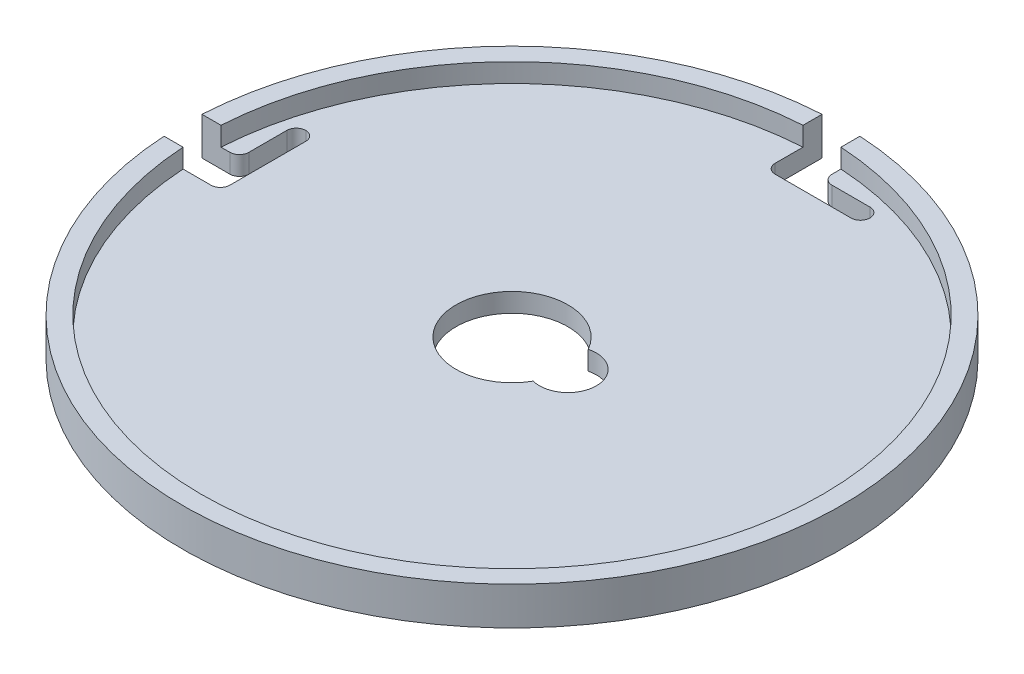
ISO-10303-21;
HEADER;
FILE_DESCRIPTION(('STEP AP214'),'2;1');
FILE_NAME('part.step','',(''),(''),'','','');
FILE_SCHEMA(('AUTOMOTIVE_DESIGN { 1 0 10303 214 1 1 1 1 }'));
ENDSEC;
DATA;
#1=APPLICATION_CONTEXT('core data for automotive mechanical design processes');
#2=APPLICATION_PROTOCOL_DEFINITION('international standard','automotive_design',2000,#1);
#3=PRODUCT_CONTEXT('',#1,'mechanical');
#4=PRODUCT('Part','Part','',(#3));
#5=PRODUCT_RELATED_PRODUCT_CATEGORY('part','',(#4));
#6=PRODUCT_DEFINITION_FORMATION('','',#4);
#7=PRODUCT_DEFINITION_CONTEXT('part definition',#1,'design');
#8=PRODUCT_DEFINITION('design','',#6,#7);
#9=PRODUCT_DEFINITION_SHAPE('','',#8);
#10=(LENGTH_UNIT() NAMED_UNIT(*) SI_UNIT(.MILLI.,.METRE.));
#11=(NAMED_UNIT(*) PLANE_ANGLE_UNIT() SI_UNIT($,.RADIAN.));
#12=(NAMED_UNIT(*) SI_UNIT($,.STERADIAN.) SOLID_ANGLE_UNIT());
#13=UNCERTAINTY_MEASURE_WITH_UNIT(LENGTH_MEASURE(1.E-05),#10,'distance_accuracy_value','');
#14=(GEOMETRIC_REPRESENTATION_CONTEXT(3) GLOBAL_UNCERTAINTY_ASSIGNED_CONTEXT((#13)) GLOBAL_UNIT_ASSIGNED_CONTEXT((#10,
#11,#12)) REPRESENTATION_CONTEXT('',''));
#15=CARTESIAN_POINT('',(0.,0.,0.));
#16=DIRECTION('',(0.,0.,1.));
#17=DIRECTION('',(1.,0.,0.));
#18=AXIS2_PLACEMENT_3D('',#15,#16,#17);
#19=CARTESIAN_POINT('',(0.,2.,0.));
#20=DIRECTION('',(0.,-1.,0.));
#21=DIRECTION('',(0.,0.,-1.));
#22=AXIS2_PLACEMENT_3D('',#19,#20,#21);
#23=CYLINDRICAL_SURFACE('',#22,34.75);
#24=DIRECTION('',(0.,-1.,0.));
#25=VECTOR('',#24,1.);
#26=CARTESIAN_POINT('',(-34.6923983027983,2.,-1.99999999999988));
#27=LINE('',#26,#25);
#28=CARTESIAN_POINT('',(-34.6923983027983,2.,-1.99999999999988));
#29=VERTEX_POINT('',#28);
#30=CARTESIAN_POINT('',(-34.6923983027983,-2.,-1.99999999999988));
#31=VERTEX_POINT('',#30);
#32=EDGE_CURVE('E263',#29,#31,#27,.T.);
#33=ORIENTED_EDGE('',*,*,#32,.F.);
#34=CARTESIAN_POINT('',(0.,2.,0.));
#35=DIRECTION('',(0.,1.,0.));
#36=DIRECTION('',(0.,0.,1.));
#37=AXIS2_PLACEMENT_3D('',#34,#35,#36);
#38=CIRCLE('',#37,34.75);
#39=CARTESIAN_POINT('',(-2.,2.,-34.6923983027983));
#40=VERTEX_POINT('',#39);
#41=EDGE_CURVE('E326',#40,#29,#38,.T.);
#42=ORIENTED_EDGE('',*,*,#41,.F.);
#43=DIRECTION('',(0.,-1.,0.));
#44=VECTOR('',#43,1.);
#45=CARTESIAN_POINT('',(-2.,2.,-34.6923983027983));
#46=LINE('',#45,#44);
#47=CARTESIAN_POINT('',(-2.,-2.,-34.6923983027983));
#48=VERTEX_POINT('',#47);
#49=EDGE_CURVE('E306',#40,#48,#46,.T.);
#50=ORIENTED_EDGE('',*,*,#49,.T.);
#51=CARTESIAN_POINT('',(0.,-2.,0.));
#52=DIRECTION('',(0.,1.,0.));
#53=DIRECTION('',(0.,0.,1.));
#54=AXIS2_PLACEMENT_3D('',#51,#52,#53);
#55=CIRCLE('',#54,34.75);
#56=EDGE_CURVE('E321',#48,#31,#55,.T.);
#57=ORIENTED_EDGE('',*,*,#56,.T.);
#58=EDGE_LOOP('',(#33,#42,#50,#57));
#59=FACE_BOUND('',#58,.T.);
#60=ADVANCED_FACE('F45',(#59),#23,.T.);
#61=CARTESIAN_POINT('',(0.,2.,0.));
#62=DIRECTION('',(0.,1.,0.));
#63=DIRECTION('',(0.,0.,1.));
#64=AXIS2_PLACEMENT_3D('',#61,#62,#63);
#65=PLANE('',#64);
#66=ORIENTED_EDGE('',*,*,#41,.T.);
#67=DIRECTION('',(1.,0.,0.));
#68=VECTOR('',#67,1.);
#69=CARTESIAN_POINT('',(-34.75,2.,-1.99999999999988));
#70=LINE('',#69,#68);
#71=CARTESIAN_POINT('',(-32.6888742540945,2.,-1.99999999999989));
#72=VERTEX_POINT('',#71);
#73=EDGE_CURVE('E239',#29,#72,#70,.T.);
#74=ORIENTED_EDGE('',*,*,#73,.T.);
#75=CARTESIAN_POINT('',(0.,2.,0.));
#76=DIRECTION('',(0.,1.,0.));
#77=DIRECTION('',(0.,0.,1.));
#78=AXIS2_PLACEMENT_3D('',#75,#76,#77);
#79=CIRCLE('',#78,32.75);
#80=CARTESIAN_POINT('',(-2.,2.,-32.6888742540945));
#81=VERTEX_POINT('',#80);
#82=EDGE_CURVE('E311',#81,#72,#79,.T.);
#83=ORIENTED_EDGE('',*,*,#82,.F.);
#84=DIRECTION('',(0.,0.,1.));
#85=VECTOR('',#84,1.);
#86=CARTESIAN_POINT('',(-2.,2.,-34.75));
#87=LINE('',#86,#85);
#88=EDGE_CURVE('E273',#40,#81,#87,.T.);
#89=ORIENTED_EDGE('',*,*,#88,.F.);
#90=EDGE_LOOP('',(#66,#74,#83,#89));
#91=FACE_BOUND('',#90,.T.);
#92=ADVANCED_FACE('F513',(#91),#65,.T.);
#93=CARTESIAN_POINT('',(0.,2.,0.));
#94=DIRECTION('',(0.,-1.,0.));
#95=DIRECTION('',(0.,0.,-1.));
#96=AXIS2_PLACEMENT_3D('',#93,#94,#95);
#97=CYLINDRICAL_SURFACE('',#96,32.75);
#98=ORIENTED_EDGE('',*,*,#82,.T.);
#99=DIRECTION('',(0.,-1.,0.));
#100=VECTOR('',#99,1.);
#101=CARTESIAN_POINT('',(-32.6888742540945,2.,-1.99999999999989));
#102=LINE('',#101,#100);
#103=CARTESIAN_POINT('',(-32.6888742540945,0.,-1.99999999999989));
#104=VERTEX_POINT('',#103);
#105=EDGE_CURVE('E259',#72,#104,#102,.T.);
#106=ORIENTED_EDGE('',*,*,#105,.T.);
#107=CARTESIAN_POINT('',(0.,0.,0.));
#108=DIRECTION('',(0.,1.,0.));
#109=DIRECTION('',(0.,0.,1.));
#110=AXIS2_PLACEMENT_3D('',#107,#108,#109);
#111=CIRCLE('',#110,32.75);
#112=CARTESIAN_POINT('',(-2.,0.,-32.6888742540945));
#113=VERTEX_POINT('',#112);
#114=EDGE_CURVE('E317',#113,#104,#111,.T.);
#115=ORIENTED_EDGE('',*,*,#114,.F.);
#116=DIRECTION('',(0.,-1.,0.));
#117=VECTOR('',#116,1.);
#118=CARTESIAN_POINT('',(-2.,2.,-32.6888742540945));
#119=LINE('',#118,#117);
#120=EDGE_CURVE('E303',#81,#113,#119,.T.);
#121=ORIENTED_EDGE('',*,*,#120,.F.);
#122=EDGE_LOOP('',(#98,#106,#115,#121));
#123=FACE_BOUND('',#122,.T.);
#124=ADVANCED_FACE('F511',(#123),#97,.F.);
#125=CARTESIAN_POINT('',(-34.6923983027983,2.,2.00000000000012));
#126=VERTEX_POINT('',#125);
#127=CARTESIAN_POINT('',(2.,2.,-34.6923983027983));
#128=VERTEX_POINT('',#127);
#129=EDGE_CURVE('E325',#126,#128,#38,.T.);
#130=ORIENTED_EDGE('',*,*,#129,.F.);
#131=DIRECTION('',(0.,-1.,0.));
#132=VECTOR('',#131,1.);
#133=CARTESIAN_POINT('',(-34.6923983027983,2.,2.00000000000012));
#134=LINE('',#133,#132);
#135=CARTESIAN_POINT('',(-34.6923983027983,-2.,2.00000000000012));
#136=VERTEX_POINT('',#135);
#137=EDGE_CURVE('E269',#126,#136,#134,.T.);
#138=ORIENTED_EDGE('',*,*,#137,.T.);
#139=CARTESIAN_POINT('',(2.,-2.,-34.6923983027983));
#140=VERTEX_POINT('',#139);
#141=EDGE_CURVE('E315',#136,#140,#55,.T.);
#142=ORIENTED_EDGE('',*,*,#141,.T.);
#143=DIRECTION('',(0.,-1.,0.));
#144=VECTOR('',#143,1.);
#145=CARTESIAN_POINT('',(2.,2.,-34.6923983027983));
#146=LINE('',#145,#144);
#147=EDGE_CURVE('E299',#128,#140,#146,.T.);
#148=ORIENTED_EDGE('',*,*,#147,.F.);
#149=EDGE_LOOP('',(#130,#138,#142,#148));
#150=FACE_BOUND('',#149,.T.);
#151=ADVANCED_FACE('F474',(#150),#23,.T.);
#152=DIRECTION('',(1.,0.,0.));
#153=VECTOR('',#152,1.);
#154=CARTESIAN_POINT('',(-34.75,2.,2.00000000000012));
#155=LINE('',#154,#153);
#156=CARTESIAN_POINT('',(-32.6888742540945,2.,2.00000000000011));
#157=VERTEX_POINT('',#156);
#158=EDGE_CURVE('E235',#126,#157,#155,.T.);
#159=ORIENTED_EDGE('',*,*,#158,.F.);
#160=ORIENTED_EDGE('',*,*,#129,.T.);
#161=DIRECTION('',(0.,0.,1.));
#162=VECTOR('',#161,1.);
#163=CARTESIAN_POINT('',(2.,2.,-34.75));
#164=LINE('',#163,#162);
#165=CARTESIAN_POINT('',(2.,2.,-32.6888742540945));
#166=VERTEX_POINT('',#165);
#167=EDGE_CURVE('E276',#128,#166,#164,.T.);
#168=ORIENTED_EDGE('',*,*,#167,.T.);
#169=EDGE_CURVE('E316',#157,#166,#79,.T.);
#170=ORIENTED_EDGE('',*,*,#169,.F.);
#171=EDGE_LOOP('',(#159,#160,#168,#170));
#172=FACE_BOUND('',#171,.T.);
#173=ADVANCED_FACE('F469',(#172),#65,.T.);
#174=CARTESIAN_POINT('',(0.,-2.,0.));
#175=DIRECTION('',(0.,1.,0.));
#176=DIRECTION('',(0.,0.,1.));
#177=AXIS2_PLACEMENT_3D('',#174,#175,#176);
#178=PLANE('',#177);
#179=CARTESIAN_POINT('',(5.9,-2.,0.));
#180=DIRECTION('',(0.,1.,0.));
#181=DIRECTION('',(0.,0.,1.));
#182=AXIS2_PLACEMENT_3D('',#179,#180,#181);
#183=CIRCLE('',#182,3.);
#184=CARTESIAN_POINT('',(5.13728813559322,-2.,2.9014256171567));
#185=VERTEX_POINT('',#184);
#186=CARTESIAN_POINT('',(5.13728813559322,-2.,-2.9014256171567));
#187=VERTEX_POINT('',#186);
#188=EDGE_CURVE('E220',#185,#187,#183,.T.);
#189=ORIENTED_EDGE('',*,*,#188,.T.);
#190=CARTESIAN_POINT('',(0.,-2.,0.));
#191=DIRECTION('',(0.,1.,0.));
#192=DIRECTION('',(0.,0.,1.));
#193=AXIS2_PLACEMENT_3D('',#190,#191,#192);
#194=CIRCLE('',#193,5.9);
#195=EDGE_CURVE('E212',#187,#185,#194,.T.);
#196=ORIENTED_EDGE('',*,*,#195,.T.);
#197=EDGE_LOOP('',(#189,#196));
#198=FACE_BOUND('',#197,.T.);
#199=DIRECTION('',(0.,0.,-1.));
#200=VECTOR('',#199,1.);
#201=CARTESIAN_POINT('',(-30.75,-2.,-1.99999999999989));
#202=LINE('',#201,#200);
#203=CARTESIAN_POINT('',(-30.75,-2.,-2.99999999999989));
#204=VERTEX_POINT('',#203);
#205=CARTESIAN_POINT('',(-30.75,-2.,-6.99999999999989));
#206=VERTEX_POINT('',#205);
#207=EDGE_CURVE('E243',#204,#206,#202,.T.);
#208=ORIENTED_EDGE('',*,*,#207,.F.);
#209=CARTESIAN_POINT('',(-31.75,-2.,-2.99999999999989));
#210=DIRECTION('',(0.,1.,0.));
#211=DIRECTION('',(0.,0.,1.));
#212=AXIS2_PLACEMENT_3D('',#209,#210,#211);
#213=CIRCLE('',#212,1.);
#214=CARTESIAN_POINT('',(-31.75,-2.,-1.99999999999989));
#215=VERTEX_POINT('',#214);
#216=EDGE_CURVE('E396',#204,#215,#213,.F.);
#217=ORIENTED_EDGE('',*,*,#216,.T.);
#218=DIRECTION('',(1.,0.,0.));
#219=VECTOR('',#218,1.);
#220=CARTESIAN_POINT('',(-34.75,-2.,-1.99999999999988));
#221=LINE('',#220,#219);
#222=EDGE_CURVE('E255',#31,#215,#221,.T.);
#223=ORIENTED_EDGE('',*,*,#222,.F.);
#224=ORIENTED_EDGE('',*,*,#56,.F.);
#225=DIRECTION('',(0.,0.,1.));
#226=VECTOR('',#225,1.);
#227=CARTESIAN_POINT('',(-2.,-2.,-34.75));
#228=LINE('',#227,#226);
#229=CARTESIAN_POINT('',(-2.,-2.,-29.75));
#230=VERTEX_POINT('',#229);
#231=EDGE_CURVE('E287',#48,#230,#228,.T.);
#232=ORIENTED_EDGE('',*,*,#231,.T.);
#233=CARTESIAN_POINT('',(-0.999999999999999,-2.,-29.75));
#234=DIRECTION('',(0.,1.,0.));
#235=DIRECTION('',(0.,0.,1.));
#236=AXIS2_PLACEMENT_3D('',#233,#234,#235);
#237=CIRCLE('',#236,1.);
#238=CARTESIAN_POINT('',(-0.999999999999999,-2.,-28.75));
#239=VERTEX_POINT('',#238);
#240=EDGE_CURVE('E446',#230,#239,#237,.T.);
#241=ORIENTED_EDGE('',*,*,#240,.T.);
#242=DIRECTION('',(1.,0.,0.));
#243=VECTOR('',#242,1.);
#244=CARTESIAN_POINT('',(-2.,-2.,-28.75));
#245=LINE('',#244,#243);
#246=CARTESIAN_POINT('',(7.,-2.,-28.75));
#247=VERTEX_POINT('',#246);
#248=EDGE_CURVE('E284',#239,#247,#245,.T.);
#249=ORIENTED_EDGE('',*,*,#248,.T.);
#250=CARTESIAN_POINT('',(7.,-2.,-29.75));
#251=DIRECTION('',(0.,1.,0.));
#252=DIRECTION('',(0.,0.,1.));
#253=AXIS2_PLACEMENT_3D('',#250,#251,#252);
#254=CIRCLE('',#253,1.);
#255=CARTESIAN_POINT('',(8.,-2.,-29.75));
#256=VERTEX_POINT('',#255);
#257=EDGE_CURVE('E62',#247,#256,#254,.T.);
#258=ORIENTED_EDGE('',*,*,#257,.T.);
#259=CARTESIAN_POINT('',(7.,-2.,-29.75));
#260=DIRECTION('',(0.,1.,0.));
#261=DIRECTION('',(0.,0.,1.));
#262=AXIS2_PLACEMENT_3D('',#259,#260,#261);
#263=CIRCLE('',#262,1.);
#264=CARTESIAN_POINT('',(7.,-2.,-30.75));
#265=VERTEX_POINT('',#264);
#266=EDGE_CURVE('E11',#256,#265,#263,.T.);
#267=ORIENTED_EDGE('',*,*,#266,.T.);
#268=DIRECTION('',(1.,0.,0.));
#269=VECTOR('',#268,1.);
#270=CARTESIAN_POINT('',(2.,-2.,-30.75));
#271=LINE('',#270,#269);
#272=CARTESIAN_POINT('',(3.,-2.,-30.75));
#273=VERTEX_POINT('',#272);
#274=EDGE_CURVE('E280',#273,#265,#271,.T.);
#275=ORIENTED_EDGE('',*,*,#274,.F.);
#276=CARTESIAN_POINT('',(3.,-2.,-31.75));
#277=DIRECTION('',(0.,1.,0.));
#278=DIRECTION('',(0.,0.,1.));
#279=AXIS2_PLACEMENT_3D('',#276,#277,#278);
#280=CIRCLE('',#279,1.);
#281=CARTESIAN_POINT('',(2.,-2.,-31.75));
#282=VERTEX_POINT('',#281);
#283=EDGE_CURVE('E393',#273,#282,#280,.F.);
#284=ORIENTED_EDGE('',*,*,#283,.T.);
#285=DIRECTION('',(0.,0.,1.));
#286=VECTOR('',#285,1.);
#287=CARTESIAN_POINT('',(2.,-2.,-34.75));
#288=LINE('',#287,#286);
#289=EDGE_CURVE('E291',#140,#282,#288,.T.);
#290=ORIENTED_EDGE('',*,*,#289,.F.);
#291=ORIENTED_EDGE('',*,*,#141,.F.);
#292=DIRECTION('',(1.,0.,0.));
#293=VECTOR('',#292,1.);
#294=CARTESIAN_POINT('',(-34.75,-2.,2.00000000000012));
#295=LINE('',#294,#293);
#296=CARTESIAN_POINT('',(-29.75,-2.,2.0000000000001));
#297=VERTEX_POINT('',#296);
#298=EDGE_CURVE('E251',#136,#297,#295,.T.);
#299=ORIENTED_EDGE('',*,*,#298,.T.);
#300=CARTESIAN_POINT('',(-29.75,-2.,1.0000000000001));
#301=DIRECTION('',(0.,1.,0.));
#302=DIRECTION('',(0.,0.,1.));
#303=AXIS2_PLACEMENT_3D('',#300,#301,#302);
#304=CIRCLE('',#303,1.);
#305=CARTESIAN_POINT('',(-28.75,-2.,1.0000000000001));
#306=VERTEX_POINT('',#305);
#307=EDGE_CURVE('E423',#297,#306,#304,.T.);
#308=ORIENTED_EDGE('',*,*,#307,.T.);
#309=DIRECTION('',(0.,0.,-1.));
#310=VECTOR('',#309,1.);
#311=CARTESIAN_POINT('',(-28.75,-2.,2.0000000000001));
#312=LINE('',#311,#310);
#313=CARTESIAN_POINT('',(-28.75,-2.,-6.9999999999999));
#314=VERTEX_POINT('',#313);
#315=EDGE_CURVE('E247',#306,#314,#312,.T.);
#316=ORIENTED_EDGE('',*,*,#315,.T.);
#317=CARTESIAN_POINT('',(-29.75,-2.,-6.9999999999999));
#318=DIRECTION('',(0.,1.,0.));
#319=DIRECTION('',(0.,0.,1.));
#320=AXIS2_PLACEMENT_3D('',#317,#318,#319);
#321=CIRCLE('',#320,1.);
#322=CARTESIAN_POINT('',(-29.75,-2.,-7.9999999999999));
#323=VERTEX_POINT('',#322);
#324=EDGE_CURVE('E429',#314,#323,#321,.T.);
#325=ORIENTED_EDGE('',*,*,#324,.T.);
#326=CARTESIAN_POINT('',(-29.75,-2.,-6.9999999999999));
#327=DIRECTION('',(0.,1.,0.));
#328=DIRECTION('',(0.,0.,1.));
#329=AXIS2_PLACEMENT_3D('',#326,#327,#328);
#330=CIRCLE('',#329,1.);
#331=EDGE_CURVE('E435',#323,#206,#330,.T.);
#332=ORIENTED_EDGE('',*,*,#331,.T.);
#333=EDGE_LOOP('',(#208,#217,#223,#224,#232,#241,#249,#258,#267,#275,#284,#290,#291,#299,#308,
#316,#325,#332));
#334=FACE_BOUND('',#333,.T.);
#335=ADVANCED_FACE('F227',(#198,#334),#178,.F.);
#336=DIRECTION('',(0.,-1.,0.));
#337=VECTOR('',#336,1.);
#338=CARTESIAN_POINT('',(-32.6888742540945,2.,2.00000000000011));
#339=LINE('',#338,#337);
#340=CARTESIAN_POINT('',(-32.6888742540945,0.,2.00000000000011));
#341=VERTEX_POINT('',#340);
#342=EDGE_CURVE('E266',#157,#341,#339,.T.);
#343=ORIENTED_EDGE('',*,*,#342,.F.);
#344=ORIENTED_EDGE('',*,*,#169,.T.);
#345=DIRECTION('',(0.,-1.,0.));
#346=VECTOR('',#345,1.);
#347=CARTESIAN_POINT('',(2.,2.,-32.6888742540945));
#348=LINE('',#347,#346);
#349=CARTESIAN_POINT('',(2.,0.,-32.6888742540945));
#350=VERTEX_POINT('',#349);
#351=EDGE_CURVE('E295',#166,#350,#348,.T.);
#352=ORIENTED_EDGE('',*,*,#351,.T.);
#353=EDGE_CURVE('E310',#341,#350,#111,.T.);
#354=ORIENTED_EDGE('',*,*,#353,.F.);
#355=EDGE_LOOP('',(#343,#344,#352,#354));
#356=FACE_BOUND('',#355,.T.);
#357=ADVANCED_FACE('F465',(#356),#97,.F.);
#358=CARTESIAN_POINT('',(0.,0.,0.));
#359=DIRECTION('',(0.,1.,0.));
#360=DIRECTION('',(0.,0.,1.));
#361=AXIS2_PLACEMENT_3D('',#358,#359,#360);
#362=PLANE('',#361);
#363=CARTESIAN_POINT('',(0.,0.,0.));
#364=DIRECTION('',(0.,1.,0.));
#365=DIRECTION('',(0.,0.,1.));
#366=AXIS2_PLACEMENT_3D('',#363,#364,#365);
#367=CIRCLE('',#366,5.9);
#368=CARTESIAN_POINT('',(5.13728813559322,0.,-2.9014256171567));
#369=VERTEX_POINT('',#368);
#370=CARTESIAN_POINT('',(5.13728813559322,0.,2.9014256171567));
#371=VERTEX_POINT('',#370);
#372=EDGE_CURVE('E215',#369,#371,#367,.T.);
#373=ORIENTED_EDGE('',*,*,#372,.F.);
#374=CARTESIAN_POINT('',(5.9,0.,0.));
#375=DIRECTION('',(0.,1.,0.));
#376=DIRECTION('',(0.,0.,1.));
#377=AXIS2_PLACEMENT_3D('',#374,#375,#376);
#378=CIRCLE('',#377,3.);
#379=EDGE_CURVE('E361',#371,#369,#378,.T.);
#380=ORIENTED_EDGE('',*,*,#379,.F.);
#381=EDGE_LOOP('',(#373,#380));
#382=FACE_BOUND('',#381,.T.);
#383=DIRECTION('',(1.,0.,0.));
#384=VECTOR('',#383,1.);
#385=CARTESIAN_POINT('',(0.,0.,-2.));
#386=LINE('',#385,#384);
#387=CARTESIAN_POINT('',(-31.75,0.,-1.99999999999989));
#388=VERTEX_POINT('',#387);
#389=EDGE_CURVE('E345',#104,#388,#386,.T.);
#390=ORIENTED_EDGE('',*,*,#389,.T.);
#391=CARTESIAN_POINT('',(-31.75,0.,-2.99999999999989));
#392=DIRECTION('',(0.,1.,0.));
#393=DIRECTION('',(0.,0.,1.));
#394=AXIS2_PLACEMENT_3D('',#391,#392,#393);
#395=CIRCLE('',#394,1.);
#396=CARTESIAN_POINT('',(-30.75,0.,-2.99999999999989));
#397=VERTEX_POINT('',#396);
#398=EDGE_CURVE('E390',#388,#397,#395,.T.);
#399=ORIENTED_EDGE('',*,*,#398,.T.);
#400=DIRECTION('',(0.,0.,-1.));
#401=VECTOR('',#400,1.);
#402=CARTESIAN_POINT('',(-30.75,0.,1.07363051169426E-13));
#403=LINE('',#402,#401);
#404=CARTESIAN_POINT('',(-30.75,0.,-6.99999999999989));
#405=VERTEX_POINT('',#404);
#406=EDGE_CURVE('E349',#397,#405,#403,.T.);
#407=ORIENTED_EDGE('',*,*,#406,.T.);
#408=CARTESIAN_POINT('',(-29.75,0.,-6.9999999999999));
#409=DIRECTION('',(0.,1.,0.));
#410=DIRECTION('',(0.,0.,1.));
#411=AXIS2_PLACEMENT_3D('',#408,#409,#410);
#412=CIRCLE('',#411,1.);
#413=CARTESIAN_POINT('',(-29.75,0.,-7.9999999999999));
#414=VERTEX_POINT('',#413);
#415=EDGE_CURVE('E432',#405,#414,#412,.F.);
#416=ORIENTED_EDGE('',*,*,#415,.T.);
#417=CARTESIAN_POINT('',(-29.75,0.,-6.9999999999999));
#418=DIRECTION('',(0.,1.,0.));
#419=DIRECTION('',(0.,0.,1.));
#420=AXIS2_PLACEMENT_3D('',#417,#418,#419);
#421=CIRCLE('',#420,1.);
#422=CARTESIAN_POINT('',(-28.75,0.,-6.9999999999999));
#423=VERTEX_POINT('',#422);
#424=EDGE_CURVE('E426',#414,#423,#421,.F.);
#425=ORIENTED_EDGE('',*,*,#424,.T.);
#426=DIRECTION('',(0.,0.,-1.));
#427=VECTOR('',#426,1.);
#428=CARTESIAN_POINT('',(-28.75,0.,1.0038008849174E-13));
#429=LINE('',#428,#427);
#430=CARTESIAN_POINT('',(-28.75,0.,1.0000000000001));
#431=VERTEX_POINT('',#430);
#432=EDGE_CURVE('E353',#431,#423,#429,.T.);
#433=ORIENTED_EDGE('',*,*,#432,.F.);
#434=CARTESIAN_POINT('',(-29.75,0.,1.0000000000001));
#435=DIRECTION('',(0.,1.,0.));
#436=DIRECTION('',(0.,0.,1.));
#437=AXIS2_PLACEMENT_3D('',#434,#435,#436);
#438=CIRCLE('',#437,1.);
#439=CARTESIAN_POINT('',(-29.75,0.,2.0000000000001));
#440=VERTEX_POINT('',#439);
#441=EDGE_CURVE('E420',#431,#440,#438,.F.);
#442=ORIENTED_EDGE('',*,*,#441,.T.);
#443=DIRECTION('',(1.,0.,0.));
#444=VECTOR('',#443,1.);
#445=CARTESIAN_POINT('',(0.,0.,1.99999999999999));
#446=LINE('',#445,#444);
#447=EDGE_CURVE('E357',#341,#440,#446,.T.);
#448=ORIENTED_EDGE('',*,*,#447,.F.);
#449=ORIENTED_EDGE('',*,*,#353,.T.);
#450=DIRECTION('',(0.,0.,1.));
#451=VECTOR('',#450,1.);
#452=CARTESIAN_POINT('',(2.,0.,0.));
#453=LINE('',#452,#451);
#454=CARTESIAN_POINT('',(2.,0.,-31.75));
#455=VERTEX_POINT('',#454);
#456=EDGE_CURVE('E330',#350,#455,#453,.T.);
#457=ORIENTED_EDGE('',*,*,#456,.T.);
#458=CARTESIAN_POINT('',(3.,0.,-31.75));
#459=DIRECTION('',(0.,1.,0.));
#460=DIRECTION('',(0.,0.,1.));
#461=AXIS2_PLACEMENT_3D('',#458,#459,#460);
#462=CIRCLE('',#461,1.);
#463=CARTESIAN_POINT('',(3.,0.,-30.75));
#464=VERTEX_POINT('',#463);
#465=EDGE_CURVE('E387',#455,#464,#462,.T.);
#466=ORIENTED_EDGE('',*,*,#465,.T.);
#467=DIRECTION('',(1.,0.,0.));
#468=VECTOR('',#467,1.);
#469=CARTESIAN_POINT('',(0.,0.,-30.75));
#470=LINE('',#469,#468);
#471=CARTESIAN_POINT('',(7.,0.,-30.75));
#472=VERTEX_POINT('',#471);
#473=EDGE_CURVE('E334',#464,#472,#470,.T.);
#474=ORIENTED_EDGE('',*,*,#473,.T.);
#475=CARTESIAN_POINT('',(7.,0.,-29.75));
#476=DIRECTION('',(0.,1.,0.));
#477=DIRECTION('',(0.,0.,1.));
#478=AXIS2_PLACEMENT_3D('',#475,#476,#477);
#479=CIRCLE('',#478,1.);
#480=CARTESIAN_POINT('',(8.,0.,-29.75));
#481=VERTEX_POINT('',#480);
#482=EDGE_CURVE('E55',#472,#481,#479,.F.);
#483=ORIENTED_EDGE('',*,*,#482,.T.);
#484=CARTESIAN_POINT('',(7.,0.,-29.75));
#485=DIRECTION('',(0.,1.,0.));
#486=DIRECTION('',(0.,0.,1.));
#487=AXIS2_PLACEMENT_3D('',#484,#485,#486);
#488=CIRCLE('',#487,1.);
#489=CARTESIAN_POINT('',(7.,0.,-28.75));
#490=VERTEX_POINT('',#489);
#491=EDGE_CURVE('E438',#481,#490,#488,.F.);
#492=ORIENTED_EDGE('',*,*,#491,.T.);
#493=DIRECTION('',(1.,0.,0.));
#494=VECTOR('',#493,1.);
#495=CARTESIAN_POINT('',(0.,0.,-28.75));
#496=LINE('',#495,#494);
#497=CARTESIAN_POINT('',(-0.999999999999999,0.,-28.75));
#498=VERTEX_POINT('',#497);
#499=EDGE_CURVE('E337',#498,#490,#496,.T.);
#500=ORIENTED_EDGE('',*,*,#499,.F.);
#501=CARTESIAN_POINT('',(-0.999999999999999,0.,-29.75));
#502=DIRECTION('',(0.,1.,0.));
#503=DIRECTION('',(0.,0.,1.));
#504=AXIS2_PLACEMENT_3D('',#501,#502,#503);
#505=CIRCLE('',#504,1.);
#506=CARTESIAN_POINT('',(-2.,0.,-29.75));
#507=VERTEX_POINT('',#506);
#508=EDGE_CURVE('E443',#498,#507,#505,.F.);
#509=ORIENTED_EDGE('',*,*,#508,.T.);
#510=DIRECTION('',(0.,0.,1.));
#511=VECTOR('',#510,1.);
#512=CARTESIAN_POINT('',(-1.99999999999999,0.,0.));
#513=LINE('',#512,#511);
#514=EDGE_CURVE('E341',#113,#507,#513,.T.);
#515=ORIENTED_EDGE('',*,*,#514,.F.);
#516=ORIENTED_EDGE('',*,*,#114,.T.);
#517=EDGE_LOOP('',(#390,#399,#407,#416,#425,#433,#442,#448,#449,#457,#466,#474,#483,#492,#500,
#509,#515,#516));
#518=FACE_BOUND('',#517,.T.);
#519=ADVANCED_FACE('F457',(#382,#518),#362,.T.);
#520=CARTESIAN_POINT('',(-2.,-2.,-34.75));
#521=DIRECTION('',(-1.,0.,0.));
#522=DIRECTION('',(0.,0.,1.));
#523=AXIS2_PLACEMENT_3D('',#520,#521,#522);
#524=PLANE('',#523);
#525=ORIENTED_EDGE('',*,*,#514,.T.);
#526=DIRECTION('',(0.,1.,0.));
#527=VECTOR('',#526,1.);
#528=CARTESIAN_POINT('',(-2.,-2.,-29.75));
#529=LINE('',#528,#527);
#530=EDGE_CURVE('E407',#507,#230,#529,.F.);
#531=ORIENTED_EDGE('',*,*,#530,.T.);
#532=ORIENTED_EDGE('',*,*,#231,.F.);
#533=ORIENTED_EDGE('',*,*,#49,.F.);
#534=ORIENTED_EDGE('',*,*,#88,.T.);
#535=ORIENTED_EDGE('',*,*,#120,.T.);
#536=EDGE_LOOP('',(#525,#531,#532,#533,#534,#535));
#537=FACE_BOUND('',#536,.T.);
#538=ADVANCED_FACE('F506',(#537),#524,.F.);
#539=CARTESIAN_POINT('',(2.,-2.,-34.75));
#540=DIRECTION('',(-1.,0.,0.));
#541=DIRECTION('',(0.,0.,1.));
#542=AXIS2_PLACEMENT_3D('',#539,#540,#541);
#543=PLANE('',#542);
#544=ORIENTED_EDGE('',*,*,#289,.T.);
#545=DIRECTION('',(0.,1.,0.));
#546=VECTOR('',#545,1.);
#547=CARTESIAN_POINT('',(2.,-2.,-31.75));
#548=LINE('',#547,#546);
#549=EDGE_CURVE('E416',#282,#455,#548,.T.);
#550=ORIENTED_EDGE('',*,*,#549,.T.);
#551=ORIENTED_EDGE('',*,*,#456,.F.);
#552=ORIENTED_EDGE('',*,*,#351,.F.);
#553=ORIENTED_EDGE('',*,*,#167,.F.);
#554=ORIENTED_EDGE('',*,*,#147,.T.);
#555=EDGE_LOOP('',(#544,#550,#551,#552,#553,#554));
#556=FACE_BOUND('',#555,.T.);
#557=ADVANCED_FACE('F462',(#556),#543,.T.);
#558=CARTESIAN_POINT('',(2.,-2.,-30.75));
#559=DIRECTION('',(0.,0.,1.));
#560=DIRECTION('',(1.,0.,0.));
#561=AXIS2_PLACEMENT_3D('',#558,#559,#560);
#562=PLANE('',#561);
#563=ORIENTED_EDGE('',*,*,#274,.T.);
#564=DIRECTION('',(0.,1.,0.));
#565=VECTOR('',#564,1.);
#566=CARTESIAN_POINT('',(7.,-2.,-30.75));
#567=LINE('',#566,#565);
#568=EDGE_CURVE('E413',#265,#472,#567,.T.);
#569=ORIENTED_EDGE('',*,*,#568,.T.);
#570=ORIENTED_EDGE('',*,*,#473,.F.);
#571=DIRECTION('',(0.,1.,0.));
#572=VECTOR('',#571,1.);
#573=CARTESIAN_POINT('',(3.,-2.,-30.75));
#574=LINE('',#573,#572);
#575=EDGE_CURVE('E410',#464,#273,#574,.F.);
#576=ORIENTED_EDGE('',*,*,#575,.T.);
#577=EDGE_LOOP('',(#563,#569,#570,#576));
#578=FACE_BOUND('',#577,.T.);
#579=ADVANCED_FACE('F484',(#578),#562,.T.);
#580=CARTESIAN_POINT('',(-2.,-2.,-28.75));
#581=DIRECTION('',(0.,0.,1.));
#582=DIRECTION('',(1.,0.,0.));
#583=AXIS2_PLACEMENT_3D('',#580,#581,#582);
#584=PLANE('',#583);
#585=ORIENTED_EDGE('',*,*,#499,.T.);
#586=DIRECTION('',(0.,1.,0.));
#587=VECTOR('',#586,1.);
#588=CARTESIAN_POINT('',(7.,-2.,-28.75));
#589=LINE('',#588,#587);
#590=EDGE_CURVE('E403',#490,#247,#589,.F.);
#591=ORIENTED_EDGE('',*,*,#590,.T.);
#592=ORIENTED_EDGE('',*,*,#248,.F.);
#593=DIRECTION('',(0.,1.,0.));
#594=VECTOR('',#593,1.);
#595=CARTESIAN_POINT('',(-0.999999999999999,0.,-28.75));
#596=LINE('',#595,#594);
#597=EDGE_CURVE('E399',#239,#498,#596,.T.);
#598=ORIENTED_EDGE('',*,*,#597,.T.);
#599=EDGE_LOOP('',(#585,#591,#592,#598));
#600=FACE_BOUND('',#599,.T.);
#601=ADVANCED_FACE('F496',(#600),#584,.F.);
#602=CARTESIAN_POINT('',(-34.75,-2.,2.00000000000012));
#603=DIRECTION('',(0.,0.,1.));
#604=DIRECTION('',(1.,0.,0.));
#605=AXIS2_PLACEMENT_3D('',#602,#603,#604);
#606=PLANE('',#605);
#607=ORIENTED_EDGE('',*,*,#447,.T.);
#608=DIRECTION('',(0.,1.,0.));
#609=VECTOR('',#608,1.);
#610=CARTESIAN_POINT('',(-29.75,-2.,2.0000000000001));
#611=LINE('',#610,#609);
#612=EDGE_CURVE('E374',#440,#297,#611,.F.);
#613=ORIENTED_EDGE('',*,*,#612,.T.);
#614=ORIENTED_EDGE('',*,*,#298,.F.);
#615=ORIENTED_EDGE('',*,*,#137,.F.);
#616=ORIENTED_EDGE('',*,*,#158,.T.);
#617=ORIENTED_EDGE('',*,*,#342,.T.);
#618=EDGE_LOOP('',(#607,#613,#614,#615,#616,#617));
#619=FACE_BOUND('',#618,.T.);
#620=ADVANCED_FACE('F548',(#619),#606,.F.);
#621=CARTESIAN_POINT('',(-34.75,-2.,-1.99999999999988));
#622=DIRECTION('',(0.,0.,1.));
#623=DIRECTION('',(1.,0.,0.));
#624=AXIS2_PLACEMENT_3D('',#621,#622,#623);
#625=PLANE('',#624);
#626=ORIENTED_EDGE('',*,*,#222,.T.);
#627=DIRECTION('',(0.,1.,0.));
#628=VECTOR('',#627,1.);
#629=CARTESIAN_POINT('',(-31.75,-2.,-1.99999999999989));
#630=LINE('',#629,#628);
#631=EDGE_CURVE('E383',#215,#388,#630,.T.);
#632=ORIENTED_EDGE('',*,*,#631,.T.);
#633=ORIENTED_EDGE('',*,*,#389,.F.);
#634=ORIENTED_EDGE('',*,*,#105,.F.);
#635=ORIENTED_EDGE('',*,*,#73,.F.);
#636=ORIENTED_EDGE('',*,*,#32,.T.);
#637=EDGE_LOOP('',(#626,#632,#633,#634,#635,#636));
#638=FACE_BOUND('',#637,.T.);
#639=ADVANCED_FACE('F517',(#638),#625,.T.);
#640=CARTESIAN_POINT('',(-30.75,-2.,-1.99999999999989));
#641=DIRECTION('',(1.,0.,0.));
#642=DIRECTION('',(0.,0.,-1.));
#643=AXIS2_PLACEMENT_3D('',#640,#641,#642);
#644=PLANE('',#643);
#645=ORIENTED_EDGE('',*,*,#207,.T.);
#646=DIRECTION('',(0.,1.,0.));
#647=VECTOR('',#646,1.);
#648=CARTESIAN_POINT('',(-30.75,-2.,-6.99999999999989));
#649=LINE('',#648,#647);
#650=EDGE_CURVE('E380',#206,#405,#649,.T.);
#651=ORIENTED_EDGE('',*,*,#650,.T.);
#652=ORIENTED_EDGE('',*,*,#406,.F.);
#653=DIRECTION('',(0.,1.,0.));
#654=VECTOR('',#653,1.);
#655=CARTESIAN_POINT('',(-30.75,-2.,-2.99999999999989));
#656=LINE('',#655,#654);
#657=EDGE_CURVE('E377',#397,#204,#656,.F.);
#658=ORIENTED_EDGE('',*,*,#657,.T.);
#659=EDGE_LOOP('',(#645,#651,#652,#658));
#660=FACE_BOUND('',#659,.T.);
#661=ADVANCED_FACE('F529',(#660),#644,.T.);
#662=CARTESIAN_POINT('',(-28.75,-2.,2.0000000000001));
#663=DIRECTION('',(1.,0.,0.));
#664=DIRECTION('',(0.,0.,-1.));
#665=AXIS2_PLACEMENT_3D('',#662,#663,#664);
#666=PLANE('',#665);
#667=ORIENTED_EDGE('',*,*,#315,.F.);
#668=DIRECTION('',(0.,1.,0.));
#669=VECTOR('',#668,1.);
#670=CARTESIAN_POINT('',(-28.75,0.,1.0000000000001));
#671=LINE('',#670,#669);
#672=EDGE_CURVE('E370',#306,#431,#671,.T.);
#673=ORIENTED_EDGE('',*,*,#672,.T.);
#674=ORIENTED_EDGE('',*,*,#432,.T.);
#675=DIRECTION('',(0.,1.,0.));
#676=VECTOR('',#675,1.);
#677=CARTESIAN_POINT('',(-28.75,-2.,-6.9999999999999));
#678=LINE('',#677,#676);
#679=EDGE_CURVE('E366',#423,#314,#678,.F.);
#680=ORIENTED_EDGE('',*,*,#679,.T.);
#681=EDGE_LOOP('',(#667,#673,#674,#680));
#682=FACE_BOUND('',#681,.T.);
#683=ADVANCED_FACE('F541',(#682),#666,.F.);
#684=CARTESIAN_POINT('',(0.,-2.,0.));
#685=DIRECTION('',(0.,1.,0.));
#686=DIRECTION('',(0.,0.,1.));
#687=AXIS2_PLACEMENT_3D('',#684,#685,#686);
#688=CYLINDRICAL_SURFACE('',#687,5.9);
#689=ORIENTED_EDGE('',*,*,#372,.T.);
#690=DIRECTION('',(0.,1.,0.));
#691=VECTOR('',#690,1.);
#692=CARTESIAN_POINT('',(5.13728813559322,-2.,2.9014256171567));
#693=LINE('',#692,#691);
#694=EDGE_CURVE('E207',#185,#371,#693,.T.);
#695=ORIENTED_EDGE('',*,*,#694,.F.);
#696=ORIENTED_EDGE('',*,*,#195,.F.);
#697=DIRECTION('',(0.,1.,0.));
#698=VECTOR('',#697,1.);
#699=CARTESIAN_POINT('',(5.13728813559322,-2.,-2.9014256171567));
#700=LINE('',#699,#698);
#701=EDGE_CURVE('E219',#187,#369,#700,.T.);
#702=ORIENTED_EDGE('',*,*,#701,.T.);
#703=EDGE_LOOP('',(#689,#695,#696,#702));
#704=FACE_BOUND('',#703,.T.);
#705=ADVANCED_FACE('F209',(#704),#688,.F.);
#706=CARTESIAN_POINT('',(5.9,-2.,0.));
#707=DIRECTION('',(0.,1.,0.));
#708=DIRECTION('',(0.,0.,1.));
#709=AXIS2_PLACEMENT_3D('',#706,#707,#708);
#710=CYLINDRICAL_SURFACE('',#709,3.);
#711=ORIENTED_EDGE('',*,*,#379,.T.);
#712=ORIENTED_EDGE('',*,*,#701,.F.);
#713=ORIENTED_EDGE('',*,*,#188,.F.);
#714=ORIENTED_EDGE('',*,*,#694,.T.);
#715=EDGE_LOOP('',(#711,#712,#713,#714));
#716=FACE_BOUND('',#715,.T.);
#717=ADVANCED_FACE('F223',(#716),#710,.F.);
#718=CARTESIAN_POINT('',(-29.75,-2.,1.0000000000001));
#719=DIRECTION('',(0.,-1.,0.));
#720=DIRECTION('',(0.,0.,-1.));
#721=AXIS2_PLACEMENT_3D('',#718,#719,#720);
#722=CYLINDRICAL_SURFACE('',#721,1.);
#723=ORIENTED_EDGE('',*,*,#307,.F.);
#724=ORIENTED_EDGE('',*,*,#612,.F.);
#725=ORIENTED_EDGE('',*,*,#441,.F.);
#726=ORIENTED_EDGE('',*,*,#672,.F.);
#727=EDGE_LOOP('',(#723,#724,#725,#726));
#728=FACE_BOUND('',#727,.T.);
#729=ADVANCED_FACE('F545',(#728),#722,.F.);
#730=CARTESIAN_POINT('',(-29.75,-2.,-6.9999999999999));
#731=DIRECTION('',(0.,1.,0.));
#732=DIRECTION('',(0.,0.,1.));
#733=AXIS2_PLACEMENT_3D('',#730,#731,#732);
#734=CYLINDRICAL_SURFACE('',#733,1.);
#735=ORIENTED_EDGE('',*,*,#650,.F.);
#736=ORIENTED_EDGE('',*,*,#331,.F.);
#737=DIRECTION('',(0.,1.,0.));
#738=VECTOR('',#737,1.);
#739=CARTESIAN_POINT('',(-29.75,-2.,-7.9999999999999));
#740=LINE('',#739,#738);
#741=EDGE_CURVE('E229',#414,#323,#740,.F.);
#742=ORIENTED_EDGE('',*,*,#741,.F.);
#743=ORIENTED_EDGE('',*,*,#415,.F.);
#744=EDGE_LOOP('',(#735,#736,#742,#743));
#745=FACE_BOUND('',#744,.T.);
#746=ADVANCED_FACE('F533',(#745),#734,.F.);
#747=CARTESIAN_POINT('',(-29.75,-2.,-6.9999999999999));
#748=DIRECTION('',(0.,-1.,0.));
#749=DIRECTION('',(0.,0.,-1.));
#750=AXIS2_PLACEMENT_3D('',#747,#748,#749);
#751=CYLINDRICAL_SURFACE('',#750,1.);
#752=ORIENTED_EDGE('',*,*,#324,.F.);
#753=ORIENTED_EDGE('',*,*,#679,.F.);
#754=ORIENTED_EDGE('',*,*,#424,.F.);
#755=ORIENTED_EDGE('',*,*,#741,.T.);
#756=EDGE_LOOP('',(#752,#753,#754,#755));
#757=FACE_BOUND('',#756,.T.);
#758=ADVANCED_FACE('F543',(#757),#751,.F.);
#759=CARTESIAN_POINT('',(-31.75,-2.,-2.99999999999989));
#760=DIRECTION('',(0.,1.,0.));
#761=DIRECTION('',(0.,0.,1.));
#762=AXIS2_PLACEMENT_3D('',#759,#760,#761);
#763=CYLINDRICAL_SURFACE('',#762,1.);
#764=ORIENTED_EDGE('',*,*,#216,.F.);
#765=ORIENTED_EDGE('',*,*,#657,.F.);
#766=ORIENTED_EDGE('',*,*,#398,.F.);
#767=ORIENTED_EDGE('',*,*,#631,.F.);
#768=EDGE_LOOP('',(#764,#765,#766,#767));
#769=FACE_BOUND('',#768,.T.);
#770=ADVANCED_FACE('F524',(#769),#763,.T.);
#771=CARTESIAN_POINT('',(7.,-2.,-29.75));
#772=DIRECTION('',(0.,1.,0.));
#773=DIRECTION('',(0.,0.,1.));
#774=AXIS2_PLACEMENT_3D('',#771,#772,#773);
#775=CYLINDRICAL_SURFACE('',#774,1.);
#776=ORIENTED_EDGE('',*,*,#568,.F.);
#777=ORIENTED_EDGE('',*,*,#266,.F.);
#778=DIRECTION('',(0.,1.,0.));
#779=VECTOR('',#778,1.);
#780=CARTESIAN_POINT('',(8.,-2.,-29.75));
#781=LINE('',#780,#779);
#782=EDGE_CURVE('E49',#481,#256,#781,.F.);
#783=ORIENTED_EDGE('',*,*,#782,.F.);
#784=ORIENTED_EDGE('',*,*,#482,.F.);
#785=EDGE_LOOP('',(#776,#777,#783,#784));
#786=FACE_BOUND('',#785,.T.);
#787=ADVANCED_FACE('F487',(#786),#775,.F.);
#788=CARTESIAN_POINT('',(7.,-2.,-29.75));
#789=DIRECTION('',(0.,-1.,0.));
#790=DIRECTION('',(0.,0.,-1.));
#791=AXIS2_PLACEMENT_3D('',#788,#789,#790);
#792=CYLINDRICAL_SURFACE('',#791,1.);
#793=ORIENTED_EDGE('',*,*,#257,.F.);
#794=ORIENTED_EDGE('',*,*,#590,.F.);
#795=ORIENTED_EDGE('',*,*,#491,.F.);
#796=ORIENTED_EDGE('',*,*,#782,.T.);
#797=EDGE_LOOP('',(#793,#794,#795,#796));
#798=FACE_BOUND('',#797,.T.);
#799=ADVANCED_FACE('F493',(#798),#792,.F.);
#800=CARTESIAN_POINT('',(-0.999999999999999,-2.,-29.75));
#801=DIRECTION('',(0.,-1.,0.));
#802=DIRECTION('',(0.,0.,-1.));
#803=AXIS2_PLACEMENT_3D('',#800,#801,#802);
#804=CYLINDRICAL_SURFACE('',#803,1.);
#805=ORIENTED_EDGE('',*,*,#240,.F.);
#806=ORIENTED_EDGE('',*,*,#530,.F.);
#807=ORIENTED_EDGE('',*,*,#508,.F.);
#808=ORIENTED_EDGE('',*,*,#597,.F.);
#809=EDGE_LOOP('',(#805,#806,#807,#808));
#810=FACE_BOUND('',#809,.T.);
#811=ADVANCED_FACE('F501',(#810),#804,.F.);
#812=CARTESIAN_POINT('',(3.,-2.,-31.75));
#813=DIRECTION('',(0.,1.,0.));
#814=DIRECTION('',(0.,0.,1.));
#815=AXIS2_PLACEMENT_3D('',#812,#813,#814);
#816=CYLINDRICAL_SURFACE('',#815,1.);
#817=ORIENTED_EDGE('',*,*,#283,.F.);
#818=ORIENTED_EDGE('',*,*,#575,.F.);
#819=ORIENTED_EDGE('',*,*,#465,.F.);
#820=ORIENTED_EDGE('',*,*,#549,.F.);
#821=EDGE_LOOP('',(#817,#818,#819,#820));
#822=FACE_BOUND('',#821,.T.);
#823=ADVANCED_FACE('F47',(#822),#816,.T.);
#824=CLOSED_SHELL('',(#60,#92,#124,#151,#173,#335,#357,#519,#538,#557,#579,#601,#620,#639,#661,
#683,#705,#717,#729,#746,#758,#770,#787,#799,#811,#823));
#825=MANIFOLD_SOLID_BREP('B2',#824);
#826=ADVANCED_BREP_SHAPE_REPRESENTATION('',(#18,#825),#14);
#827=SHAPE_DEFINITION_REPRESENTATION(#9,#826);
ENDSEC;
END-ISO-10303-21;
